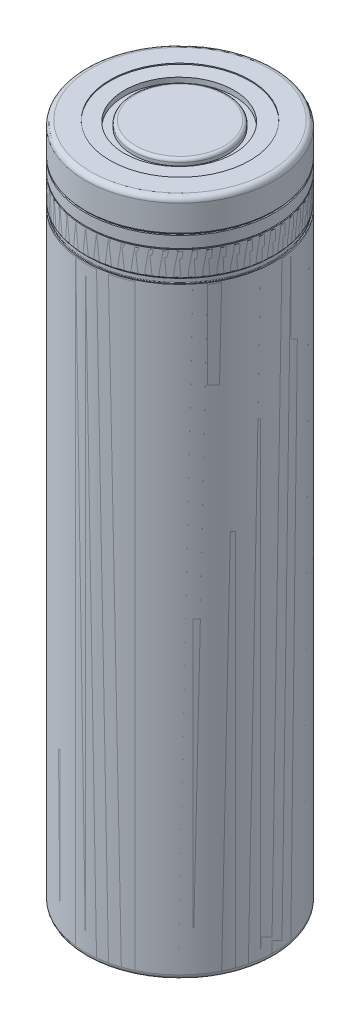
ISO-10303-21;
HEADER;
FILE_DESCRIPTION(('STEP AP214'),'2;1');
FILE_NAME('part.step','',(''),(''),'','','');
FILE_SCHEMA(('AUTOMOTIVE_DESIGN { 1 0 10303 214 1 1 1 1 }'));
ENDSEC;
DATA;
#1=APPLICATION_CONTEXT('core data for automotive mechanical design processes');
#2=APPLICATION_PROTOCOL_DEFINITION('international standard','automotive_design',2000,#1);
#3=PRODUCT_CONTEXT('',#1,'mechanical');
#4=PRODUCT('Part','Part','',(#3));
#5=PRODUCT_RELATED_PRODUCT_CATEGORY('part','',(#4));
#6=PRODUCT_DEFINITION_FORMATION('','',#4);
#7=PRODUCT_DEFINITION_CONTEXT('part definition',#1,'design');
#8=PRODUCT_DEFINITION('design','',#6,#7);
#9=PRODUCT_DEFINITION_SHAPE('','',#8);
#10=(LENGTH_UNIT() NAMED_UNIT(*) SI_UNIT(.MILLI.,.METRE.));
#11=(NAMED_UNIT(*) PLANE_ANGLE_UNIT() SI_UNIT($,.RADIAN.));
#12=(NAMED_UNIT(*) SI_UNIT($,.STERADIAN.) SOLID_ANGLE_UNIT());
#13=UNCERTAINTY_MEASURE_WITH_UNIT(LENGTH_MEASURE(1.E-05),#10,'distance_accuracy_value','');
#14=(GEOMETRIC_REPRESENTATION_CONTEXT(3) GLOBAL_UNCERTAINTY_ASSIGNED_CONTEXT((#13)) GLOBAL_UNIT_ASSIGNED_CONTEXT((#10,
#11,#12)) REPRESENTATION_CONTEXT('',''));
#15=CARTESIAN_POINT('',(0.,0.,0.));
#16=DIRECTION('',(0.,0.,1.));
#17=DIRECTION('',(1.,0.,0.));
#18=AXIS2_PLACEMENT_3D('',#15,#16,#17);
#19=CARTESIAN_POINT('',(0.,61.4383725555333,0.));
#20=DIRECTION('',(0.,1.,0.));
#21=DIRECTION('',(0.,0.,1.));
#22=AXIS2_PLACEMENT_3D('',#19,#20,#21);
#23=PLANE('',#22);
#24=CARTESIAN_POINT('',(0.,61.4383725555333,0.));
#25=DIRECTION('',(0.,1.,0.));
#26=DIRECTION('',(0.,0.,1.));
#27=AXIS2_PLACEMENT_3D('',#24,#25,#26);
#28=CIRCLE('',#27,9.165);
#29=CARTESIAN_POINT('',(0.,61.4383725555333,9.165));
#30=VERTEX_POINT('',#29);
#31=EDGE_CURVE('E53',#30,#30,#28,.T.);
#32=ORIENTED_EDGE('',*,*,#31,.T.);
#33=EDGE_LOOP('',(#32));
#34=FACE_BOUND('',#33,.T.);
#35=ADVANCED_FACE('F49',(#34),#23,.T.);
#36=CARTESIAN_POINT('',(0.,65.85,0.));
#37=DIRECTION('',(0.,-1.,0.));
#38=DIRECTION('',(0.,0.,-1.));
#39=AXIS2_PLACEMENT_3D('',#36,#37,#38);
#40=CYLINDRICAL_SURFACE('',#39,9.165);
#41=CARTESIAN_POINT('',(0.,59.0909668765543,0.));
#42=DIRECTION('',(0.,-1.,0.));
#43=DIRECTION('',(0.,0.,-1.));
#44=AXIS2_PLACEMENT_3D('',#41,#42,#43);
#45=CIRCLE('',#44,9.165);
#46=CARTESIAN_POINT('',(0.,59.0909668765543,-9.165));
#47=VERTEX_POINT('',#46);
#48=EDGE_CURVE('E12',#47,#47,#45,.T.);
#49=ORIENTED_EDGE('',*,*,#48,.F.);
#50=EDGE_LOOP('',(#49));
#51=FACE_BOUND('',#50,.T.);
#52=ORIENTED_EDGE('',*,*,#31,.F.);
#53=EDGE_LOOP('',(#52));
#54=FACE_BOUND('',#53,.T.);
#55=ADVANCED_FACE('F51',(#51,#54),#40,.T.);
#56=CARTESIAN_POINT('',(0.,59.0909668765543,0.));
#57=DIRECTION('',(0.,1.,0.));
#58=DIRECTION('',(0.,0.,1.));
#59=AXIS2_PLACEMENT_3D('',#56,#57,#58);
#60=PLANE('',#59);
#61=ORIENTED_EDGE('',*,*,#48,.T.);
#62=EDGE_LOOP('',(#61));
#63=FACE_BOUND('',#62,.T.);
#64=ADVANCED_FACE('F67',(#63),#60,.F.);
#65=CLOSED_SHELL('',(#35,#55,#64));
#66=MANIFOLD_SOLID_BREP('B2_NOT_SHOWN',#65);
#67=CARTESIAN_POINT('',(0.,0.1,0.));
#68=DIRECTION('',(0.,-1.,0.));
#69=DIRECTION('',(0.,0.,-1.));
#70=AXIS2_PLACEMENT_3D('',#67,#68,#69);
#71=PLANE('',#70);
#72=CARTESIAN_POINT('',(0.,0.1,0.));
#73=DIRECTION('',(0.,-1.,0.));
#74=DIRECTION('',(0.,0.,-1.));
#75=AXIS2_PLACEMENT_3D('',#72,#73,#74);
#76=CIRCLE('',#75,7.21277114192617);
#77=CARTESIAN_POINT('',(0.,0.1,-7.21277114192617));
#78=VERTEX_POINT('',#77);
#79=EDGE_CURVE('E123',#78,#78,#76,.T.);
#80=ORIENTED_EDGE('',*,*,#79,.T.);
#81=EDGE_LOOP('',(#80));
#82=FACE_BOUND('',#81,.T.);
#83=ADVANCED_FACE('F100',(#82),#71,.T.);
#84=CARTESIAN_POINT('',(0.,0.1,0.));
#85=DIRECTION('',(0.,-1.,0.));
#86=DIRECTION('',(0.,0.,-1.));
#87=AXIS2_PLACEMENT_3D('',#84,#85,#86);
#88=CYLINDRICAL_SURFACE('',#87,7.21277114192617);
#89=ORIENTED_EDGE('',*,*,#79,.F.);
#90=EDGE_LOOP('',(#89));
#91=FACE_BOUND('',#90,.T.);
#92=CARTESIAN_POINT('',(0.,0.,0.));
#93=DIRECTION('',(0.,-1.,0.));
#94=DIRECTION('',(0.,0.,-1.));
#95=AXIS2_PLACEMENT_3D('',#92,#93,#94);
#96=CIRCLE('',#95,7.21277114192617);
#97=CARTESIAN_POINT('',(0.,0.,-7.21277114192617));
#98=VERTEX_POINT('',#97);
#99=EDGE_CURVE('E119',#98,#98,#96,.T.);
#100=ORIENTED_EDGE('',*,*,#99,.T.);
#101=EDGE_LOOP('',(#100));
#102=FACE_BOUND('',#101,.T.);
#103=ADVANCED_FACE('F128',(#91,#102),#88,.F.);
#104=CARTESIAN_POINT('',(0.,0.,0.));
#105=DIRECTION('',(0.,1.,0.));
#106=DIRECTION('',(0.,0.,1.));
#107=AXIS2_PLACEMENT_3D('',#104,#105,#106);
#108=PLANE('',#107);
#109=CARTESIAN_POINT('',(0.,0.,0.));
#110=DIRECTION('',(0.,1.,0.));
#111=DIRECTION('',(0.,0.,1.));
#112=AXIS2_PLACEMENT_3D('',#109,#110,#111);
#113=CIRCLE('',#112,8.665);
#114=CARTESIAN_POINT('',(0.,0.,8.665));
#115=VERTEX_POINT('',#114);
#116=EDGE_CURVE('E114',#115,#115,#113,.F.);
#117=ORIENTED_EDGE('',*,*,#116,.T.);
#118=EDGE_LOOP('',(#117));
#119=FACE_BOUND('',#118,.T.);
#120=ORIENTED_EDGE('',*,*,#99,.F.);
#121=EDGE_LOOP('',(#120));
#122=FACE_BOUND('',#121,.T.);
#123=ADVANCED_FACE('F131',(#119,#122),#108,.F.);
#124=CARTESIAN_POINT('',(0.,0.5,0.));
#125=DIRECTION('',(0.,1.,0.));
#126=DIRECTION('',(0.,0.,1.));
#127=AXIS2_PLACEMENT_3D('',#124,#125,#126);
#128=TOROIDAL_SURFACE('',#127,8.665,0.5);
#129=ORIENTED_EDGE('',*,*,#116,.F.);
#130=EDGE_LOOP('',(#129));
#131=FACE_BOUND('',#130,.T.);
#132=CARTESIAN_POINT('',(0.,0.5,0.));
#133=DIRECTION('',(0.,1.,0.));
#134=DIRECTION('',(0.,0.,1.));
#135=AXIS2_PLACEMENT_3D('',#132,#133,#134);
#136=CIRCLE('',#135,9.165);
#137=CARTESIAN_POINT('',(0.,0.5,9.165));
#138=VERTEX_POINT('',#137);
#139=EDGE_CURVE('E108',#138,#138,#136,.T.);
#140=ORIENTED_EDGE('',*,*,#139,.F.);
#141=EDGE_LOOP('',(#140));
#142=FACE_BOUND('',#141,.T.);
#143=ADVANCED_FACE('F136',(#131,#142),#128,.T.);
#144=CARTESIAN_POINT('',(0.,65.85,0.));
#145=DIRECTION('',(0.,-1.,0.));
#146=DIRECTION('',(0.,0.,-1.));
#147=AXIS2_PLACEMENT_3D('',#144,#145,#146);
#148=CYLINDRICAL_SURFACE('',#147,9.165);
#149=ORIENTED_EDGE('',*,*,#139,.T.);
#150=EDGE_LOOP('',(#149));
#151=FACE_BOUND('',#150,.T.);
#152=CARTESIAN_POINT('',(0.,58.5264909565543,0.));
#153=DIRECTION('',(0.,1.,0.));
#154=DIRECTION('',(0.,0.,1.));
#155=AXIS2_PLACEMENT_3D('',#152,#153,#154);
#156=CIRCLE('',#155,9.165);
#157=CARTESIAN_POINT('',(0.,58.5264909565543,9.165));
#158=VERTEX_POINT('',#157);
#159=EDGE_CURVE('E48',#158,#158,#156,.T.);
#160=ORIENTED_EDGE('',*,*,#159,.F.);
#161=EDGE_LOOP('',(#160));
#162=FACE_BOUND('',#161,.T.);
#163=ADVANCED_FACE('F102',(#151,#162),#148,.T.);
#164=CARTESIAN_POINT('',(0.,58.5264909565542,0.));
#165=DIRECTION('',(0.,1.,0.));
#166=DIRECTION('',(0.,0.,1.));
#167=AXIS2_PLACEMENT_3D('',#164,#165,#166);
#168=PLANE('',#167);
#169=ORIENTED_EDGE('',*,*,#159,.T.);
#170=EDGE_LOOP('',(#169));
#171=FACE_BOUND('',#170,.T.);
#172=ADVANCED_FACE('F148',(#171),#168,.T.);
#173=CLOSED_SHELL('',(#83,#103,#123,#143,#163,#172));
#174=MANIFOLD_SOLID_BREP('B7_NOT_SHOWN',#173);
#175=CARTESIAN_POINT('',(0.,65.85,0.));
#176=DIRECTION('',(0.,-1.,0.));
#177=DIRECTION('',(0.,0.,-1.));
#178=AXIS2_PLACEMENT_3D('',#175,#176,#177);
#179=CYLINDRICAL_SURFACE('',#178,9.165);
#180=CARTESIAN_POINT('',(0.,62.8280784136977,0.));
#181=DIRECTION('',(0.,1.,0.));
#182=DIRECTION('',(0.,0.,1.));
#183=AXIS2_PLACEMENT_3D('',#180,#181,#182);
#184=CIRCLE('',#183,9.165);
#185=CARTESIAN_POINT('',(0.,62.8280784136977,9.165));
#186=VERTEX_POINT('',#185);
#187=EDGE_CURVE('E236',#186,#186,#184,.T.);
#188=ORIENTED_EDGE('',*,*,#187,.T.);
#189=EDGE_LOOP('',(#188));
#190=FACE_BOUND('',#189,.T.);
#191=CARTESIAN_POINT('',(0.,65.35,0.));
#192=DIRECTION('',(0.,1.,0.));
#193=DIRECTION('',(0.,0.,1.));
#194=AXIS2_PLACEMENT_3D('',#191,#192,#193);
#195=CIRCLE('',#194,9.165);
#196=CARTESIAN_POINT('',(0.,65.35,9.165));
#197=VERTEX_POINT('',#196);
#198=EDGE_CURVE('E263',#197,#197,#195,.F.);
#199=ORIENTED_EDGE('',*,*,#198,.T.);
#200=EDGE_LOOP('',(#199));
#201=FACE_BOUND('',#200,.T.);
#202=ADVANCED_FACE('F210',(#190,#201),#179,.T.);
#203=CARTESIAN_POINT('',(0.,65.85,0.));
#204=DIRECTION('',(0.,1.,0.));
#205=DIRECTION('',(0.,0.,1.));
#206=AXIS2_PLACEMENT_3D('',#203,#204,#205);
#207=PLANE('',#206);
#208=CARTESIAN_POINT('',(0.,65.85,0.));
#209=DIRECTION('',(0.,1.,0.));
#210=DIRECTION('',(0.,0.,1.));
#211=AXIS2_PLACEMENT_3D('',#208,#209,#210);
#212=CIRCLE('',#211,6.78458179531968);
#213=CARTESIAN_POINT('',(0.,65.85,6.78458179531968));
#214=VERTEX_POINT('',#213);
#215=EDGE_CURVE('E257',#214,#214,#212,.T.);
#216=ORIENTED_EDGE('',*,*,#215,.F.);
#217=EDGE_LOOP('',(#216));
#218=FACE_BOUND('',#217,.T.);
#219=CARTESIAN_POINT('',(0.,65.85,0.));
#220=DIRECTION('',(0.,1.,0.));
#221=DIRECTION('',(0.,0.,1.));
#222=AXIS2_PLACEMENT_3D('',#219,#220,#221);
#223=CIRCLE('',#222,8.665);
#224=CARTESIAN_POINT('',(0.,65.85,8.665));
#225=VERTEX_POINT('',#224);
#226=EDGE_CURVE('E260',#225,#225,#223,.T.);
#227=ORIENTED_EDGE('',*,*,#226,.T.);
#228=EDGE_LOOP('',(#227));
#229=FACE_BOUND('',#228,.T.);
#230=ADVANCED_FACE('F323',(#218,#229),#207,.T.);
#231=CARTESIAN_POINT('',(0.,65.35,0.));
#232=DIRECTION('',(0.,1.,0.));
#233=DIRECTION('',(0.,0.,1.));
#234=AXIS2_PLACEMENT_3D('',#231,#232,#233);
#235=TOROIDAL_SURFACE('',#234,8.665,0.5);
#236=ORIENTED_EDGE('',*,*,#198,.F.);
#237=EDGE_LOOP('',(#236));
#238=FACE_BOUND('',#237,.T.);
#239=ORIENTED_EDGE('',*,*,#226,.F.);
#240=EDGE_LOOP('',(#239));
#241=FACE_BOUND('',#240,.T.);
#242=ADVANCED_FACE('F329',(#238,#241),#235,.T.);
#243=CARTESIAN_POINT('',(0.,65.75,0.));
#244=DIRECTION('',(0.,1.,0.));
#245=DIRECTION('',(0.,0.,1.));
#246=AXIS2_PLACEMENT_3D('',#243,#244,#245);
#247=CYLINDRICAL_SURFACE('',#246,6.78458179531968);
#248=CARTESIAN_POINT('',(0.,65.75,0.));
#249=DIRECTION('',(0.,1.,0.));
#250=DIRECTION('',(0.,0.,1.));
#251=AXIS2_PLACEMENT_3D('',#248,#249,#250);
#252=CIRCLE('',#251,6.78458179531968);
#253=CARTESIAN_POINT('',(0.,65.75,6.78458179531968));
#254=VERTEX_POINT('',#253);
#255=EDGE_CURVE('E254',#254,#254,#252,.T.);
#256=ORIENTED_EDGE('',*,*,#255,.F.);
#257=EDGE_LOOP('',(#256));
#258=FACE_BOUND('',#257,.T.);
#259=ORIENTED_EDGE('',*,*,#215,.T.);
#260=EDGE_LOOP('',(#259));
#261=FACE_BOUND('',#260,.T.);
#262=ADVANCED_FACE('F387',(#258,#261),#247,.F.);
#263=CARTESIAN_POINT('',(0.,65.75,0.));
#264=DIRECTION('',(0.,1.,0.));
#265=DIRECTION('',(0.,0.,1.));
#266=AXIS2_PLACEMENT_3D('',#263,#264,#265);
#267=PLANE('',#266);
#268=CARTESIAN_POINT('',(0.,65.75,0.0812922289983031));
#269=DIRECTION('',(0.,1.,0.));
#270=DIRECTION('',(0.,0.,1.));
#271=AXIS2_PLACEMENT_3D('',#268,#269,#270);
#272=CIRCLE('',#271,5.31676366411);
#273=CARTESIAN_POINT('',(0.,65.75,5.3980558931083));
#274=VERTEX_POINT('',#273);
#275=EDGE_CURVE('E253',#274,#274,#272,.T.);
#276=ORIENTED_EDGE('',*,*,#275,.F.);
#277=EDGE_LOOP('',(#276));
#278=FACE_BOUND('',#277,.T.);
#279=ORIENTED_EDGE('',*,*,#255,.T.);
#280=EDGE_LOOP('',(#279));
#281=FACE_BOUND('',#280,.T.);
#282=ADVANCED_FACE('F392',(#278,#281),#267,.T.);
#283=CARTESIAN_POINT('',(0.,65.25,0.0812922289983031));
#284=DIRECTION('',(0.,1.,0.));
#285=DIRECTION('',(0.,0.,1.));
#286=AXIS2_PLACEMENT_3D('',#283,#284,#285);
#287=CYLINDRICAL_SURFACE('',#286,5.31676366411);
#288=ORIENTED_EDGE('',*,*,#275,.T.);
#289=EDGE_LOOP('',(#288));
#290=FACE_BOUND('',#289,.T.);
#291=CARTESIAN_POINT('',(0.,65.25,0.0812922289983031));
#292=DIRECTION('',(0.,1.,0.));
#293=DIRECTION('',(0.,0.,1.));
#294=AXIS2_PLACEMENT_3D('',#291,#292,#293);
#295=CIRCLE('',#294,5.31676366411);
#296=CARTESIAN_POINT('',(0.,65.25,5.3980558931083));
#297=VERTEX_POINT('',#296);
#298=EDGE_CURVE('E250',#297,#297,#295,.T.);
#299=ORIENTED_EDGE('',*,*,#298,.F.);
#300=EDGE_LOOP('',(#299));
#301=FACE_BOUND('',#300,.T.);
#302=ADVANCED_FACE('F396',(#290,#301),#287,.F.);
#303=CARTESIAN_POINT('',(0.,65.25,0.0812922289983031));
#304=DIRECTION('',(0.,1.,0.));
#305=DIRECTION('',(0.,0.,1.));
#306=AXIS2_PLACEMENT_3D('',#303,#304,#305);
#307=PLANE('',#306);
#308=CARTESIAN_POINT('',(0.,65.25,0.));
#309=DIRECTION('',(0.,1.,0.));
#310=DIRECTION('',(0.,0.,1.));
#311=AXIS2_PLACEMENT_3D('',#308,#309,#310);
#312=CIRCLE('',#311,4.6044453575515);
#313=CARTESIAN_POINT('',(0.,65.25,4.6044453575515));
#314=VERTEX_POINT('',#313);
#315=EDGE_CURVE('E246',#314,#314,#312,.T.);
#316=ORIENTED_EDGE('',*,*,#315,.F.);
#317=EDGE_LOOP('',(#316));
#318=FACE_BOUND('',#317,.T.);
#319=ORIENTED_EDGE('',*,*,#298,.T.);
#320=EDGE_LOOP('',(#319));
#321=FACE_BOUND('',#320,.T.);
#322=ADVANCED_FACE('F399',(#318,#321),#307,.T.);
#323=CARTESIAN_POINT('',(0.,65.25,0.));
#324=DIRECTION('',(0.,1.,0.));
#325=DIRECTION('',(0.,0.,1.));
#326=AXIS2_PLACEMENT_3D('',#323,#324,#325);
#327=CYLINDRICAL_SURFACE('',#326,4.6044453575515);
#328=CARTESIAN_POINT('',(0.,65.55,0.));
#329=DIRECTION('',(0.,1.,0.));
#330=DIRECTION('',(0.,0.,1.));
#331=AXIS2_PLACEMENT_3D('',#328,#329,#330);
#332=CIRCLE('',#331,4.6044453575515);
#333=CARTESIAN_POINT('',(0.,65.55,4.6044453575515));
#334=VERTEX_POINT('',#333);
#335=EDGE_CURVE('E249',#334,#334,#332,.F.);
#336=ORIENTED_EDGE('',*,*,#335,.T.);
#337=EDGE_LOOP('',(#336));
#338=FACE_BOUND('',#337,.T.);
#339=ORIENTED_EDGE('',*,*,#315,.T.);
#340=EDGE_LOOP('',(#339));
#341=FACE_BOUND('',#340,.T.);
#342=ADVANCED_FACE('F336',(#338,#341),#327,.T.);
#343=CARTESIAN_POINT('',(0.,65.85,0.));
#344=DIRECTION('',(0.,1.,0.));
#345=DIRECTION('',(0.,0.,1.));
#346=AXIS2_PLACEMENT_3D('',#343,#344,#345);
#347=CIRCLE('',#346,4.3044453575515);
#348=CARTESIAN_POINT('',(0.,65.85,4.3044453575515));
#349=VERTEX_POINT('',#348);
#350=EDGE_CURVE('E245',#349,#349,#347,.T.);
#351=ORIENTED_EDGE('',*,*,#350,.T.);
#352=EDGE_LOOP('',(#351));
#353=FACE_BOUND('',#352,.T.);
#354=ADVANCED_FACE('F332',(#353),#207,.T.);
#355=CARTESIAN_POINT('',(0.,65.55,0.));
#356=DIRECTION('',(0.,1.,0.));
#357=DIRECTION('',(0.,0.,1.));
#358=AXIS2_PLACEMENT_3D('',#355,#356,#357);
#359=TOROIDAL_SURFACE('',#358,4.3044453575515,0.3);
#360=ORIENTED_EDGE('',*,*,#335,.F.);
#361=EDGE_LOOP('',(#360));
#362=FACE_BOUND('',#361,.T.);
#363=ORIENTED_EDGE('',*,*,#350,.F.);
#364=EDGE_LOOP('',(#363));
#365=FACE_BOUND('',#364,.T.);
#366=ADVANCED_FACE('F381',(#362,#365),#359,.T.);
#367=CARTESIAN_POINT('',(0.,61.4389356105031,0.));
#368=DIRECTION('',(0.,1.,0.));
#369=DIRECTION('',(0.,0.,1.));
#370=AXIS2_PLACEMENT_3D('',#367,#368,#369);
#371=CYLINDRICAL_SURFACE('',#370,9.03);
#372=CARTESIAN_POINT('',(0.,61.5116672237414,0.));
#373=DIRECTION('',(0.,-1.,0.));
#374=DIRECTION('',(0.,0.,-1.));
#375=AXIS2_PLACEMENT_3D('',#372,#373,#374);
#376=CIRCLE('',#375,9.03);
#377=CARTESIAN_POINT('',(0.,61.5116672237414,-9.03));
#378=VERTEX_POINT('',#377);
#379=EDGE_CURVE('E221',#378,#378,#376,.F.);
#380=ORIENTED_EDGE('',*,*,#379,.T.);
#381=EDGE_LOOP('',(#380));
#382=FACE_BOUND('',#381,.T.);
#383=CARTESIAN_POINT('',(0.,62.6389356105031,0.));
#384=DIRECTION('',(0.,1.,0.));
#385=DIRECTION('',(0.,0.,1.));
#386=AXIS2_PLACEMENT_3D('',#383,#384,#385);
#387=CIRCLE('',#386,9.03);
#388=CARTESIAN_POINT('',(0.,62.6389356105031,9.03));
#389=VERTEX_POINT('',#388);
#390=EDGE_CURVE('E242',#389,#389,#387,.F.);
#391=ORIENTED_EDGE('',*,*,#390,.T.);
#392=EDGE_LOOP('',(#391));
#393=FACE_BOUND('',#392,.T.);
#394=ADVANCED_FACE('F342',(#382,#393),#371,.T.);
#395=CARTESIAN_POINT('',(0.,62.6389356105031,0.));
#396=DIRECTION('',(0.,1.,0.));
#397=DIRECTION('',(0.,0.,1.));
#398=AXIS2_PLACEMENT_3D('',#395,#396,#397);
#399=TOROIDAL_SURFACE('',#398,9.13,0.1);
#400=CARTESIAN_POINT('',(0.,62.7335070120999,0.));
#401=DIRECTION('',(0.,-1.,0.));
#402=DIRECTION('',(0.,0.,-1.));
#403=AXIS2_PLACEMENT_3D('',#400,#401,#402);
#404=CIRCLE('',#403,9.0975000000003);
#405=CARTESIAN_POINT('',(0.,62.7335070120999,-9.0975000000003));
#406=VERTEX_POINT('',#405);
#407=EDGE_CURVE('E239',#406,#406,#404,.T.);
#408=ORIENTED_EDGE('',*,*,#407,.T.);
#409=EDGE_LOOP('',(#408));
#410=FACE_BOUND('',#409,.T.);
#411=ORIENTED_EDGE('',*,*,#390,.F.);
#412=EDGE_LOOP('',(#411));
#413=FACE_BOUND('',#412,.T.);
#414=ADVANCED_FACE('F338',(#410,#413),#399,.F.);
#415=CARTESIAN_POINT('',(0.,62.8280784136977,0.));
#416=DIRECTION('',(0.,1.,0.));
#417=DIRECTION('',(0.,0.,1.));
#418=AXIS2_PLACEMENT_3D('',#415,#416,#417);
#419=TOROIDAL_SURFACE('',#418,9.06500000000023,0.1);
#420=ORIENTED_EDGE('',*,*,#187,.F.);
#421=EDGE_LOOP('',(#420));
#422=FACE_BOUND('',#421,.T.);
#423=ORIENTED_EDGE('',*,*,#407,.F.);
#424=EDGE_LOOP('',(#423));
#425=FACE_BOUND('',#424,.T.);
#426=ADVANCED_FACE('F341',(#422,#425),#419,.T.);
#427=CARTESIAN_POINT('',(0.,33.1639563582554,0.));
#428=DIRECTION('',(0.,1.,0.));
#429=DIRECTION('',(0.,0.,1.));
#430=AXIS2_PLACEMENT_3D('',#427,#428,#429);
#431=CYLINDRICAL_SURFACE('',#430,9.165);
#432=CARTESIAN_POINT('',(0.,61.2896874949371,0.));
#433=DIRECTION('',(0.,1.,0.));
#434=DIRECTION('',(0.,0.,1.));
#435=AXIS2_PLACEMENT_3D('',#432,#433,#434);
#436=CIRCLE('',#435,9.165);
#437=CARTESIAN_POINT('',(0.,61.2896874949371,9.165));
#438=VERTEX_POINT('',#437);
#439=EDGE_CURVE('E230',#438,#438,#436,.F.);
#440=ORIENTED_EDGE('',*,*,#439,.T.);
#441=EDGE_LOOP('',(#440));
#442=FACE_BOUND('',#441,.T.);
#443=CARTESIAN_POINT('',(0.,59.1358776161363,0.));
#444=DIRECTION('',(0.,-1.,0.));
#445=DIRECTION('',(0.,0.,-1.));
#446=AXIS2_PLACEMENT_3D('',#443,#444,#445);
#447=CIRCLE('',#446,9.165);
#448=CARTESIAN_POINT('',(0.,59.1358776161363,-9.165));
#449=VERTEX_POINT('',#448);
#450=EDGE_CURVE('E233',#449,#449,#447,.F.);
#451=ORIENTED_EDGE('',*,*,#450,.T.);
#452=EDGE_LOOP('',(#451));
#453=FACE_BOUND('',#452,.T.);
#454=ADVANCED_FACE('F346',(#442,#453),#431,.T.);
#455=CARTESIAN_POINT('',(0.,58.5264909565542,0.));
#456=DIRECTION('',(0.,1.,0.));
#457=DIRECTION('',(0.,0.,1.));
#458=AXIS2_PLACEMENT_3D('',#455,#456,#457);
#459=CYLINDRICAL_SURFACE('',#458,9.02855086487638);
#460=CARTESIAN_POINT('',(0.,58.9131531202096,0.));
#461=DIRECTION('',(0.,-1.,0.));
#462=DIRECTION('',(0.,0.,-1.));
#463=AXIS2_PLACEMENT_3D('',#460,#461,#462);
#464=CIRCLE('',#463,9.02855086487638);
#465=CARTESIAN_POINT('',(0.,58.9131531202096,-9.02855086487638));
#466=VERTEX_POINT('',#465);
#467=EDGE_CURVE('E217',#466,#466,#464,.T.);
#468=ORIENTED_EDGE('',*,*,#467,.T.);
#469=EDGE_LOOP('',(#468));
#470=FACE_BOUND('',#469,.T.);
#471=CARTESIAN_POINT('',(0.,58.5998287928989,0.));
#472=DIRECTION('',(0.,-1.,0.));
#473=DIRECTION('',(0.,0.,-1.));
#474=AXIS2_PLACEMENT_3D('',#471,#472,#473);
#475=CIRCLE('',#474,9.02855086487638);
#476=CARTESIAN_POINT('',(0.,58.5998287928989,-9.02855086487638));
#477=VERTEX_POINT('',#476);
#478=EDGE_CURVE('E266',#477,#477,#475,.F.);
#479=ORIENTED_EDGE('',*,*,#478,.T.);
#480=EDGE_LOOP('',(#479));
#481=FACE_BOUND('',#480,.T.);
#482=ADVANCED_FACE('F307',(#470,#481),#459,.T.);
#483=CARTESIAN_POINT('',(0.,0.,0.));
#484=DIRECTION('',(0.,1.,0.));
#485=DIRECTION('',(0.,0.,1.));
#486=AXIS2_PLACEMENT_3D('',#483,#484,#485);
#487=PLANE('',#486);
#488=CARTESIAN_POINT('',(0.,0.,0.));
#489=DIRECTION('',(0.,-1.,0.));
#490=DIRECTION('',(0.,0.,-1.));
#491=AXIS2_PLACEMENT_3D('',#488,#489,#490);
#492=CIRCLE('',#491,7.3654845312251);
#493=CARTESIAN_POINT('',(0.,0.,-7.3654845312251));
#494=VERTEX_POINT('',#493);
#495=EDGE_CURVE('E288',#494,#494,#492,.T.);
#496=ORIENTED_EDGE('',*,*,#495,.F.);
#497=EDGE_LOOP('',(#496));
#498=FACE_BOUND('',#497,.T.);
#499=CARTESIAN_POINT('',(0.,0.,0.));
#500=DIRECTION('',(0.,1.,0.));
#501=DIRECTION('',(0.,0.,1.));
#502=AXIS2_PLACEMENT_3D('',#499,#500,#501);
#503=CIRCLE('',#502,8.665);
#504=CARTESIAN_POINT('',(0.,0.,8.665));
#505=VERTEX_POINT('',#504);
#506=EDGE_CURVE('E281',#505,#505,#503,.F.);
#507=ORIENTED_EDGE('',*,*,#506,.T.);
#508=EDGE_LOOP('',(#507));
#509=FACE_BOUND('',#508,.T.);
#510=ADVANCED_FACE('F303',(#498,#509),#487,.F.);
#511=CARTESIAN_POINT('',(0.,84.4490255548531,0.));
#512=DIRECTION('',(0.,-1.,0.));
#513=DIRECTION('',(0.,0.,-1.));
#514=AXIS2_PLACEMENT_3D('',#511,#512,#513);
#515=CYLINDRICAL_SURFACE('',#514,9.165);
#516=CARTESIAN_POINT('',(0.,58.3771042969721,0.));
#517=DIRECTION('',(0.,1.,0.));
#518=DIRECTION('',(0.,0.,1.));
#519=AXIS2_PLACEMENT_3D('',#516,#517,#518);
#520=CIRCLE('',#519,9.165);
#521=CARTESIAN_POINT('',(0.,58.3771042969721,9.165));
#522=VERTEX_POINT('',#521);
#523=EDGE_CURVE('E278',#522,#522,#520,.F.);
#524=ORIENTED_EDGE('',*,*,#523,.T.);
#525=EDGE_LOOP('',(#524));
#526=FACE_BOUND('',#525,.T.);
#527=CARTESIAN_POINT('',(0.,0.5,0.));
#528=DIRECTION('',(0.,1.,0.));
#529=DIRECTION('',(0.,0.,1.));
#530=AXIS2_PLACEMENT_3D('',#527,#528,#529);
#531=CIRCLE('',#530,9.165);
#532=CARTESIAN_POINT('',(0.,0.5,9.165));
#533=VERTEX_POINT('',#532);
#534=EDGE_CURVE('E284',#533,#533,#531,.T.);
#535=ORIENTED_EDGE('',*,*,#534,.T.);
#536=EDGE_LOOP('',(#535));
#537=FACE_BOUND('',#536,.T.);
#538=ADVANCED_FACE('F306',(#526,#537),#515,.T.);
#539=CARTESIAN_POINT('',(0.,0.5,0.));
#540=DIRECTION('',(0.,1.,0.));
#541=DIRECTION('',(0.,0.,1.));
#542=AXIS2_PLACEMENT_3D('',#539,#540,#541);
#543=TOROIDAL_SURFACE('',#542,8.665,0.5);
#544=ORIENTED_EDGE('',*,*,#506,.F.);
#545=EDGE_LOOP('',(#544));
#546=FACE_BOUND('',#545,.T.);
#547=ORIENTED_EDGE('',*,*,#534,.F.);
#548=EDGE_LOOP('',(#547));
#549=FACE_BOUND('',#548,.T.);
#550=ADVANCED_FACE('F299',(#546,#549),#543,.T.);
#551=CARTESIAN_POINT('',(0.,0.1,0.));
#552=DIRECTION('',(0.,-1.,0.));
#553=DIRECTION('',(0.,0.,-1.));
#554=AXIS2_PLACEMENT_3D('',#551,#552,#553);
#555=CYLINDRICAL_SURFACE('',#554,7.3654845312251);
#556=CARTESIAN_POINT('',(0.,0.1,0.));
#557=DIRECTION('',(0.,-1.,0.));
#558=DIRECTION('',(0.,0.,-1.));
#559=AXIS2_PLACEMENT_3D('',#556,#557,#558);
#560=CIRCLE('',#559,7.3654845312251);
#561=CARTESIAN_POINT('',(0.,0.1,-7.3654845312251));
#562=VERTEX_POINT('',#561);
#563=EDGE_CURVE('E287',#562,#562,#560,.T.);
#564=ORIENTED_EDGE('',*,*,#563,.F.);
#565=EDGE_LOOP('',(#564));
#566=FACE_BOUND('',#565,.T.);
#567=ORIENTED_EDGE('',*,*,#495,.T.);
#568=EDGE_LOOP('',(#567));
#569=FACE_BOUND('',#568,.T.);
#570=ADVANCED_FACE('F296',(#566,#569),#555,.F.);
#571=CARTESIAN_POINT('',(0.,0.1,0.));
#572=DIRECTION('',(0.,-1.,0.));
#573=DIRECTION('',(0.,0.,-1.));
#574=AXIS2_PLACEMENT_3D('',#571,#572,#573);
#575=PLANE('',#574);
#576=ORIENTED_EDGE('',*,*,#563,.T.);
#577=EDGE_LOOP('',(#576));
#578=FACE_BOUND('',#577,.T.);
#579=ADVANCED_FACE('F294',(#578),#575,.T.);
#580=CARTESIAN_POINT('',(0.,58.3771042969721,0.));
#581=DIRECTION('',(0.,1.,0.));
#582=DIRECTION('',(0.,0.,1.));
#583=AXIS2_PLACEMENT_3D('',#580,#581,#582);
#584=TOROIDAL_SURFACE('',#583,9.015,0.15);
#585=CARTESIAN_POINT('',(0.,58.5107389945278,0.));
#586=DIRECTION('',(0.,-1.,0.));
#587=DIRECTION('',(0.,0.,-1.));
#588=AXIS2_PLACEMENT_3D('',#585,#586,#587);
#589=CIRCLE('',#588,9.08313051892562);
#590=CARTESIAN_POINT('',(0.,58.5107389945278,-9.08313051892562));
#591=VERTEX_POINT('',#590);
#592=EDGE_CURVE('E275',#591,#591,#589,.T.);
#593=ORIENTED_EDGE('',*,*,#592,.T.);
#594=EDGE_LOOP('',(#593));
#595=FACE_BOUND('',#594,.T.);
#596=ORIENTED_EDGE('',*,*,#523,.F.);
#597=EDGE_LOOP('',(#596));
#598=FACE_BOUND('',#597,.T.);
#599=ADVANCED_FACE('F474',(#595,#598),#584,.T.);
#600=CARTESIAN_POINT('',(0.,58.5998287928989,0.));
#601=DIRECTION('',(0.,-1.,0.));
#602=DIRECTION('',(0.,0.,-1.));
#603=AXIS2_PLACEMENT_3D('',#600,#601,#602);
#604=TOROIDAL_SURFACE('',#603,9.12855086487638,0.1);
#605=ORIENTED_EDGE('',*,*,#478,.F.);
#606=EDGE_LOOP('',(#605));
#607=FACE_BOUND('',#606,.T.);
#608=ORIENTED_EDGE('',*,*,#592,.F.);
#609=EDGE_LOOP('',(#608));
#610=FACE_BOUND('',#609,.T.);
#611=ADVANCED_FACE('F352',(#607,#610),#604,.F.);
#612=CARTESIAN_POINT('',(0.,61.2896874949371,0.));
#613=DIRECTION('',(0.,1.,0.));
#614=DIRECTION('',(0.,0.,1.));
#615=AXIS2_PLACEMENT_3D('',#612,#613,#614);
#616=TOROIDAL_SURFACE('',#615,9.015,0.15);
#617=CARTESIAN_POINT('',(0.,61.4228753322195,0.));
#618=DIRECTION('',(0.,-1.,0.));
#619=DIRECTION('',(0.,0.,-1.));
#620=AXIS2_PLACEMENT_3D('',#617,#618,#619);
#621=CIRCLE('',#620,9.08399999999992);
#622=CARTESIAN_POINT('',(0.,61.4228753322195,-9.08399999999992));
#623=VERTEX_POINT('',#622);
#624=EDGE_CURVE('E225',#623,#623,#621,.T.);
#625=ORIENTED_EDGE('',*,*,#624,.T.);
#626=EDGE_LOOP('',(#625));
#627=FACE_BOUND('',#626,.T.);
#628=ORIENTED_EDGE('',*,*,#439,.F.);
#629=EDGE_LOOP('',(#628));
#630=FACE_BOUND('',#629,.T.);
#631=ADVANCED_FACE('F348',(#627,#630),#616,.T.);
#632=CARTESIAN_POINT('',(0.,59.1358776161363,0.));
#633=DIRECTION('',(0.,-1.,0.));
#634=DIRECTION('',(0.,0.,-1.));
#635=AXIS2_PLACEMENT_3D('',#632,#633,#634);
#636=TOROIDAL_SURFACE('',#635,9.015,0.15);
#637=CARTESIAN_POINT('',(0.,59.0022429185807,0.));
#638=DIRECTION('',(0.,1.,0.));
#639=DIRECTION('',(0.,0.,1.));
#640=AXIS2_PLACEMENT_3D('',#637,#638,#639);
#641=CIRCLE('',#640,9.08313051892562);
#642=CARTESIAN_POINT('',(0.,59.0022429185807,9.08313051892562));
#643=VERTEX_POINT('',#642);
#644=EDGE_CURVE('E99',#643,#643,#641,.T.);
#645=ORIENTED_EDGE('',*,*,#644,.T.);
#646=EDGE_LOOP('',(#645));
#647=FACE_BOUND('',#646,.T.);
#648=ORIENTED_EDGE('',*,*,#450,.F.);
#649=EDGE_LOOP('',(#648));
#650=FACE_BOUND('',#649,.T.);
#651=ADVANCED_FACE('F351',(#647,#650),#636,.T.);
#652=CARTESIAN_POINT('',(0.,61.5116672237414,0.));
#653=DIRECTION('',(0.,-1.,0.));
#654=DIRECTION('',(0.,0.,-1.));
#655=AXIS2_PLACEMENT_3D('',#652,#653,#654);
#656=TOROIDAL_SURFACE('',#655,9.13,0.1);
#657=ORIENTED_EDGE('',*,*,#379,.F.);
#658=EDGE_LOOP('',(#657));
#659=FACE_BOUND('',#658,.T.);
#660=ORIENTED_EDGE('',*,*,#624,.F.);
#661=EDGE_LOOP('',(#660));
#662=FACE_BOUND('',#661,.T.);
#663=ADVANCED_FACE('F355',(#659,#662),#656,.F.);
#664=CARTESIAN_POINT('',(0.,58.9131531202096,0.));
#665=DIRECTION('',(0.,-1.,0.));
#666=DIRECTION('',(0.,0.,-1.));
#667=AXIS2_PLACEMENT_3D('',#664,#665,#666);
#668=TOROIDAL_SURFACE('',#667,9.12855086487638,0.1);
#669=ORIENTED_EDGE('',*,*,#644,.F.);
#670=EDGE_LOOP('',(#669));
#671=FACE_BOUND('',#670,.T.);
#672=ORIENTED_EDGE('',*,*,#467,.F.);
#673=EDGE_LOOP('',(#672));
#674=FACE_BOUND('',#673,.T.);
#675=ADVANCED_FACE('F212',(#671,#674),#668,.F.);
#676=CLOSED_SHELL('',(#202,#230,#242,#262,#282,#302,#322,#342,#354,#366,#394,#414,#426,#454,
#482,#510,#538,#550,#570,#579,#599,#611,#631,#651,#663,#675));
#677=MANIFOLD_SOLID_BREP('B43',#676);
#678=CARTESIAN_POINT('',(0.,62.6389356105031,0.));
#679=DIRECTION('',(0.,1.,0.));
#680=DIRECTION('',(0.,0.,1.));
#681=AXIS2_PLACEMENT_3D('',#678,#679,#680);
#682=PLANE('',#681);
#683=CARTESIAN_POINT('',(0.,62.6389356105031,0.));
#684=DIRECTION('',(0.,-1.,0.));
#685=DIRECTION('',(0.,0.,-1.));
#686=AXIS2_PLACEMENT_3D('',#683,#684,#685);
#687=CIRCLE('',#686,9.165);
#688=CARTESIAN_POINT('',(0.,62.6389356105031,-9.165));
#689=VERTEX_POINT('',#688);
#690=EDGE_CURVE('E209',#689,#689,#687,.T.);
#691=ORIENTED_EDGE('',*,*,#690,.F.);
#692=EDGE_LOOP('',(#691));
#693=FACE_BOUND('',#692,.T.);
#694=ADVANCED_FACE('F629',(#693),#682,.T.);
#695=CARTESIAN_POINT('',(0.,65.85,0.));
#696=DIRECTION('',(0.,-1.,0.));
#697=DIRECTION('',(0.,0.,-1.));
#698=AXIS2_PLACEMENT_3D('',#695,#696,#697);
#699=CYLINDRICAL_SURFACE('',#698,9.165);
#700=CARTESIAN_POINT('',(0.,61.5383725555333,0.));
#701=DIRECTION('',(0.,1.,0.));
#702=DIRECTION('',(0.,0.,1.));
#703=AXIS2_PLACEMENT_3D('',#700,#701,#702);
#704=CIRCLE('',#703,9.165);
#705=CARTESIAN_POINT('',(0.,61.5383725555333,9.165));
#706=VERTEX_POINT('',#705);
#707=EDGE_CURVE('E637',#706,#706,#704,.T.);
#708=ORIENTED_EDGE('',*,*,#707,.T.);
#709=EDGE_LOOP('',(#708));
#710=FACE_BOUND('',#709,.T.);
#711=ORIENTED_EDGE('',*,*,#690,.T.);
#712=EDGE_LOOP('',(#711));
#713=FACE_BOUND('',#712,.T.);
#714=ADVANCED_FACE('F631',(#710,#713),#699,.T.);
#715=CARTESIAN_POINT('',(0.,61.5383725555333,0.));
#716=DIRECTION('',(0.,1.,0.));
#717=DIRECTION('',(0.,0.,1.));
#718=AXIS2_PLACEMENT_3D('',#715,#716,#717);
#719=PLANE('',#718);
#720=ORIENTED_EDGE('',*,*,#707,.F.);
#721=EDGE_LOOP('',(#720));
#722=FACE_BOUND('',#721,.T.);
#723=ADVANCED_FACE('F646',(#722),#719,.F.);
#724=CLOSED_SHELL('',(#694,#714,#723));
#725=MANIFOLD_SOLID_BREP('B94_NOT_SHOWN',#724);
#726=ADVANCED_BREP_SHAPE_REPRESENTATION('',(#18,#66,#174,#677,#725),#14);
#727=SHAPE_DEFINITION_REPRESENTATION(#9,#726);
ENDSEC;
END-ISO-10303-21;
